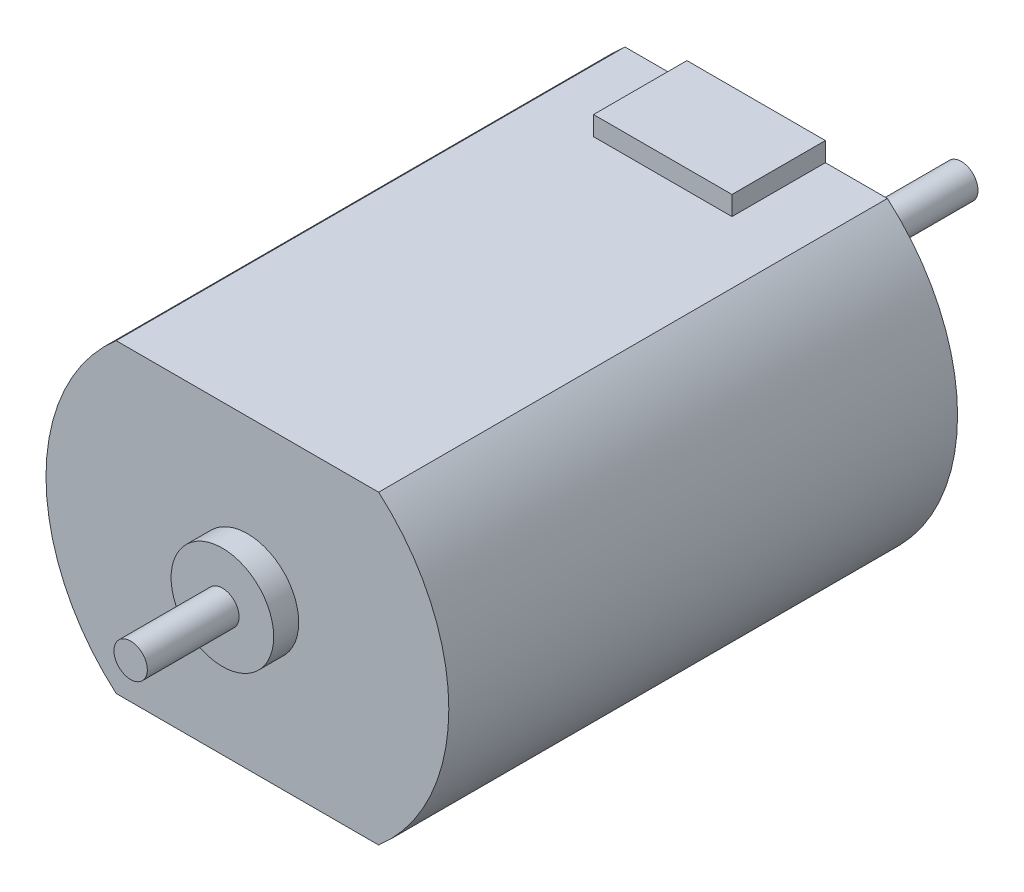
ISO-10303-21;
HEADER;
FILE_DESCRIPTION(('STEP AP214'),'2;1');
FILE_NAME('part.step','',(''),(''),'','','');
FILE_SCHEMA(('AUTOMOTIVE_DESIGN { 1 0 10303 214 1 1 1 1 }'));
ENDSEC;
DATA;
#1=APPLICATION_CONTEXT('core data for automotive mechanical design processes');
#2=APPLICATION_PROTOCOL_DEFINITION('international standard','automotive_design',2000,#1);
#3=PRODUCT_CONTEXT('',#1,'mechanical');
#4=PRODUCT('Part','Part','',(#3));
#5=PRODUCT_RELATED_PRODUCT_CATEGORY('part','',(#4));
#6=PRODUCT_DEFINITION_FORMATION('','',#4);
#7=PRODUCT_DEFINITION_CONTEXT('part definition',#1,'design');
#8=PRODUCT_DEFINITION('design','',#6,#7);
#9=PRODUCT_DEFINITION_SHAPE('','',#8);
#10=(LENGTH_UNIT() NAMED_UNIT(*) SI_UNIT(.MILLI.,.METRE.));
#11=(NAMED_UNIT(*) PLANE_ANGLE_UNIT() SI_UNIT($,.RADIAN.));
#12=(NAMED_UNIT(*) SI_UNIT($,.STERADIAN.) SOLID_ANGLE_UNIT());
#13=UNCERTAINTY_MEASURE_WITH_UNIT(LENGTH_MEASURE(1.E-05),#10,'distance_accuracy_value','');
#14=(GEOMETRIC_REPRESENTATION_CONTEXT(3) GLOBAL_UNCERTAINTY_ASSIGNED_CONTEXT((#13)) GLOBAL_UNIT_ASSIGNED_CONTEXT((#10,
#11,#12)) REPRESENTATION_CONTEXT('',''));
#15=CARTESIAN_POINT('',(0.,0.,0.));
#16=DIRECTION('',(0.,0.,1.));
#17=DIRECTION('',(1.,0.,0.));
#18=AXIS2_PLACEMENT_3D('',#15,#16,#17);
#19=CARTESIAN_POINT('',(-7.86765689389161,9.16,30.5));
#20=DIRECTION('',(0.,-1.,0.));
#21=DIRECTION('',(0.,0.,-1.));
#22=AXIS2_PLACEMENT_3D('',#19,#20,#21);
#23=PLANE('',#22);
#24=DIRECTION('',(0.,0.,1.));
#25=VECTOR('',#24,1.);
#26=CARTESIAN_POINT('',(-4.15,9.16,0.));
#27=LINE('',#26,#25);
#28=CARTESIAN_POINT('',(-4.15,9.16,0.));
#29=VERTEX_POINT('',#28);
#30=CARTESIAN_POINT('',(-4.15,9.16,5.6));
#31=VERTEX_POINT('',#30);
#32=EDGE_CURVE('E61',#29,#31,#27,.T.);
#33=ORIENTED_EDGE('',*,*,#32,.F.);
#34=DIRECTION('',(-1.,0.,0.));
#35=VECTOR('',#34,1.);
#36=CARTESIAN_POINT('',(-7.86765689389161,9.16,0.));
#37=LINE('',#36,#35);
#38=CARTESIAN_POINT('',(-7.86765689389161,9.16,0.));
#39=VERTEX_POINT('',#38);
#40=EDGE_CURVE('E157',#29,#39,#37,.T.);
#41=ORIENTED_EDGE('',*,*,#40,.T.);
#42=DIRECTION('',(0.,0.,-1.));
#43=VECTOR('',#42,1.);
#44=CARTESIAN_POINT('',(-7.86765689389161,9.16,30.5));
#45=LINE('',#44,#43);
#46=CARTESIAN_POINT('',(-7.86765689389161,9.16,30.5));
#47=VERTEX_POINT('',#46);
#48=EDGE_CURVE('E167',#47,#39,#45,.T.);
#49=ORIENTED_EDGE('',*,*,#48,.F.);
#50=DIRECTION('',(-1.,0.,0.));
#51=VECTOR('',#50,1.);
#52=CARTESIAN_POINT('',(-7.86765689389161,9.16,30.5));
#53=LINE('',#52,#51);
#54=CARTESIAN_POINT('',(7.86765689389161,9.16,30.5));
#55=VERTEX_POINT('',#54);
#56=EDGE_CURVE('E147',#55,#47,#53,.T.);
#57=ORIENTED_EDGE('',*,*,#56,.F.);
#58=DIRECTION('',(0.,0.,-1.));
#59=VECTOR('',#58,1.);
#60=CARTESIAN_POINT('',(7.86765689389161,9.16,30.5));
#61=LINE('',#60,#59);
#62=CARTESIAN_POINT('',(7.86765689389161,9.16,0.));
#63=VERTEX_POINT('',#62);
#64=EDGE_CURVE('E43',#55,#63,#61,.T.);
#65=ORIENTED_EDGE('',*,*,#64,.T.);
#66=CARTESIAN_POINT('',(4.15,9.16,0.));
#67=VERTEX_POINT('',#66);
#68=EDGE_CURVE('E158',#63,#67,#37,.T.);
#69=ORIENTED_EDGE('',*,*,#68,.T.);
#70=DIRECTION('',(0.,0.,-1.));
#71=VECTOR('',#70,1.);
#72=CARTESIAN_POINT('',(4.15,9.16,0.));
#73=LINE('',#72,#71);
#74=CARTESIAN_POINT('',(4.15,9.16,5.6));
#75=VERTEX_POINT('',#74);
#76=EDGE_CURVE('E123',#75,#67,#73,.T.);
#77=ORIENTED_EDGE('',*,*,#76,.F.);
#78=DIRECTION('',(1.,0.,0.));
#79=VECTOR('',#78,1.);
#80=CARTESIAN_POINT('',(-4.15,9.16,5.6));
#81=LINE('',#80,#79);
#82=EDGE_CURVE('E56',#31,#75,#81,.T.);
#83=ORIENTED_EDGE('',*,*,#82,.F.);
#84=EDGE_LOOP('',(#33,#41,#49,#57,#65,#69,#77,#83));
#85=FACE_BOUND('',#84,.T.);
#86=ADVANCED_FACE('F39',(#85),#23,.F.);
#87=CARTESIAN_POINT('',(0.,0.,30.5));
#88=DIRECTION('',(0.,0.,-1.));
#89=DIRECTION('',(-1.,0.,0.));
#90=AXIS2_PLACEMENT_3D('',#87,#88,#89);
#91=CYLINDRICAL_SURFACE('',#90,12.075);
#92=CARTESIAN_POINT('',(0.,0.,0.));
#93=DIRECTION('',(0.,0.,1.));
#94=DIRECTION('',(1.,0.,0.));
#95=AXIS2_PLACEMENT_3D('',#92,#93,#94);
#96=CIRCLE('',#95,12.075);
#97=CARTESIAN_POINT('',(7.86765689389161,-9.16,0.));
#98=VERTEX_POINT('',#97);
#99=EDGE_CURVE('E141',#98,#63,#96,.T.);
#100=ORIENTED_EDGE('',*,*,#99,.T.);
#101=ORIENTED_EDGE('',*,*,#64,.F.);
#102=CARTESIAN_POINT('',(0.,0.,30.5));
#103=DIRECTION('',(0.,0.,1.));
#104=DIRECTION('',(1.,0.,0.));
#105=AXIS2_PLACEMENT_3D('',#102,#103,#104);
#106=CIRCLE('',#105,12.075);
#107=CARTESIAN_POINT('',(7.86765689389161,-9.16,30.5));
#108=VERTEX_POINT('',#107);
#109=EDGE_CURVE('E144',#108,#55,#106,.T.);
#110=ORIENTED_EDGE('',*,*,#109,.F.);
#111=DIRECTION('',(0.,0.,-1.));
#112=VECTOR('',#111,1.);
#113=CARTESIAN_POINT('',(7.86765689389161,-9.16,30.5));
#114=LINE('',#113,#112);
#115=EDGE_CURVE('E154',#108,#98,#114,.T.);
#116=ORIENTED_EDGE('',*,*,#115,.T.);
#117=EDGE_LOOP('',(#100,#101,#110,#116));
#118=FACE_BOUND('',#117,.T.);
#119=ADVANCED_FACE('F41',(#118),#91,.T.);
#120=CARTESIAN_POINT('',(0.,0.,30.5));
#121=DIRECTION('',(0.,0.,-1.));
#122=DIRECTION('',(-1.,0.,0.));
#123=AXIS2_PLACEMENT_3D('',#120,#121,#122);
#124=CYLINDRICAL_SURFACE('',#123,12.075);
#125=CARTESIAN_POINT('',(0.,0.,0.));
#126=DIRECTION('',(0.,0.,1.));
#127=DIRECTION('',(1.,0.,0.));
#128=AXIS2_PLACEMENT_3D('',#125,#126,#127);
#129=CIRCLE('',#128,12.075);
#130=CARTESIAN_POINT('',(-7.86765689389161,-9.16,0.));
#131=VERTEX_POINT('',#130);
#132=EDGE_CURVE('E160',#39,#131,#129,.T.);
#133=ORIENTED_EDGE('',*,*,#132,.T.);
#134=DIRECTION('',(0.,0.,-1.));
#135=VECTOR('',#134,1.);
#136=CARTESIAN_POINT('',(-7.86765689389161,-9.16,30.5));
#137=LINE('',#136,#135);
#138=CARTESIAN_POINT('',(-7.86765689389161,-9.16,30.5));
#139=VERTEX_POINT('',#138);
#140=EDGE_CURVE('E165',#139,#131,#137,.T.);
#141=ORIENTED_EDGE('',*,*,#140,.F.);
#142=CARTESIAN_POINT('',(0.,0.,30.5));
#143=DIRECTION('',(0.,0.,1.));
#144=DIRECTION('',(1.,0.,0.));
#145=AXIS2_PLACEMENT_3D('',#142,#143,#144);
#146=CIRCLE('',#145,12.075);
#147=EDGE_CURVE('E150',#47,#139,#146,.T.);
#148=ORIENTED_EDGE('',*,*,#147,.F.);
#149=ORIENTED_EDGE('',*,*,#48,.T.);
#150=EDGE_LOOP('',(#133,#141,#148,#149));
#151=FACE_BOUND('',#150,.T.);
#152=ADVANCED_FACE('F231',(#151),#124,.T.);
#153=CARTESIAN_POINT('',(-7.86765689389161,-9.16,30.5));
#154=DIRECTION('',(0.,1.,0.));
#155=DIRECTION('',(0.,0.,1.));
#156=AXIS2_PLACEMENT_3D('',#153,#154,#155);
#157=PLANE('',#156);
#158=DIRECTION('',(1.,0.,0.));
#159=VECTOR('',#158,1.);
#160=CARTESIAN_POINT('',(-7.86765689389161,-9.16,0.));
#161=LINE('',#160,#159);
#162=EDGE_CURVE('E148',#131,#98,#161,.T.);
#163=ORIENTED_EDGE('',*,*,#162,.T.);
#164=ORIENTED_EDGE('',*,*,#115,.F.);
#165=DIRECTION('',(1.,0.,0.));
#166=VECTOR('',#165,1.);
#167=CARTESIAN_POINT('',(-7.86765689389161,-9.16,30.5));
#168=LINE('',#167,#166);
#169=EDGE_CURVE('E152',#139,#108,#168,.T.);
#170=ORIENTED_EDGE('',*,*,#169,.F.);
#171=ORIENTED_EDGE('',*,*,#140,.T.);
#172=EDGE_LOOP('',(#163,#164,#170,#171));
#173=FACE_BOUND('',#172,.T.);
#174=ADVANCED_FACE('F226',(#173),#157,.F.);
#175=CARTESIAN_POINT('',(0.,0.,30.5));
#176=DIRECTION('',(0.,0.,1.));
#177=DIRECTION('',(1.,0.,0.));
#178=AXIS2_PLACEMENT_3D('',#175,#176,#177);
#179=PLANE('',#178);
#180=CARTESIAN_POINT('',(0.,0.,30.5));
#181=DIRECTION('',(0.,0.,1.));
#182=DIRECTION('',(1.,0.,0.));
#183=AXIS2_PLACEMENT_3D('',#180,#181,#182);
#184=CIRCLE('',#183,3.075);
#185=CARTESIAN_POINT('',(3.075,0.,30.5));
#186=VERTEX_POINT('',#185);
#187=EDGE_CURVE('E48',#186,#186,#184,.T.);
#188=ORIENTED_EDGE('',*,*,#187,.F.);
#189=EDGE_LOOP('',(#188));
#190=FACE_BOUND('',#189,.T.);
#191=ORIENTED_EDGE('',*,*,#109,.T.);
#192=ORIENTED_EDGE('',*,*,#56,.T.);
#193=ORIENTED_EDGE('',*,*,#147,.T.);
#194=ORIENTED_EDGE('',*,*,#169,.T.);
#195=EDGE_LOOP('',(#191,#192,#193,#194));
#196=FACE_BOUND('',#195,.T.);
#197=ADVANCED_FACE('F223',(#190,#196),#179,.T.);
#198=CARTESIAN_POINT('',(0.,0.,0.));
#199=DIRECTION('',(0.,0.,1.));
#200=DIRECTION('',(1.,0.,0.));
#201=AXIS2_PLACEMENT_3D('',#198,#199,#200);
#202=PLANE('',#201);
#203=CARTESIAN_POINT('',(0.,0.,0.));
#204=DIRECTION('',(0.,0.,-1.));
#205=DIRECTION('',(-1.,0.,0.));
#206=AXIS2_PLACEMENT_3D('',#203,#204,#205);
#207=CIRCLE('',#206,4.23);
#208=CARTESIAN_POINT('',(-4.23,0.,0.));
#209=VERTEX_POINT('',#208);
#210=EDGE_CURVE('E138',#209,#209,#207,.T.);
#211=ORIENTED_EDGE('',*,*,#210,.F.);
#212=EDGE_LOOP('',(#211));
#213=FACE_BOUND('',#212,.T.);
#214=ORIENTED_EDGE('',*,*,#99,.F.);
#215=ORIENTED_EDGE('',*,*,#162,.F.);
#216=ORIENTED_EDGE('',*,*,#132,.F.);
#217=ORIENTED_EDGE('',*,*,#40,.F.);
#218=DIRECTION('',(0.,-1.,0.));
#219=VECTOR('',#218,1.);
#220=CARTESIAN_POINT('',(-4.15,10.31,0.));
#221=LINE('',#220,#219);
#222=CARTESIAN_POINT('',(-4.15,10.31,0.));
#223=VERTEX_POINT('',#222);
#224=EDGE_CURVE('E186',#223,#29,#221,.T.);
#225=ORIENTED_EDGE('',*,*,#224,.F.);
#226=DIRECTION('',(-1.,0.,0.));
#227=VECTOR('',#226,1.);
#228=CARTESIAN_POINT('',(-4.15,10.31,0.));
#229=LINE('',#228,#227);
#230=CARTESIAN_POINT('',(4.15,10.31,0.));
#231=VERTEX_POINT('',#230);
#232=EDGE_CURVE('E119',#231,#223,#229,.T.);
#233=ORIENTED_EDGE('',*,*,#232,.F.);
#234=DIRECTION('',(0.,-1.,0.));
#235=VECTOR('',#234,1.);
#236=CARTESIAN_POINT('',(4.15,10.31,0.));
#237=LINE('',#236,#235);
#238=EDGE_CURVE('E131',#231,#67,#237,.T.);
#239=ORIENTED_EDGE('',*,*,#238,.T.);
#240=ORIENTED_EDGE('',*,*,#68,.F.);
#241=EDGE_LOOP('',(#214,#215,#216,#217,#225,#233,#239,#240));
#242=FACE_BOUND('',#241,.T.);
#243=ADVANCED_FACE('F182',(#213,#242),#202,.F.);
#244=CARTESIAN_POINT('',(0.,0.,-2.));
#245=DIRECTION('',(0.,0.,1.));
#246=DIRECTION('',(1.,0.,0.));
#247=AXIS2_PLACEMENT_3D('',#244,#245,#246);
#248=CYLINDRICAL_SURFACE('',#247,4.23);
#249=CARTESIAN_POINT('',(0.,0.,-2.));
#250=DIRECTION('',(0.,0.,-1.));
#251=DIRECTION('',(-1.,0.,0.));
#252=AXIS2_PLACEMENT_3D('',#249,#250,#251);
#253=CIRCLE('',#252,4.23);
#254=CARTESIAN_POINT('',(-4.23,0.,-2.));
#255=VERTEX_POINT('',#254);
#256=EDGE_CURVE('E129',#255,#255,#253,.T.);
#257=ORIENTED_EDGE('',*,*,#256,.F.);
#258=EDGE_LOOP('',(#257));
#259=FACE_BOUND('',#258,.T.);
#260=ORIENTED_EDGE('',*,*,#210,.T.);
#261=EDGE_LOOP('',(#260));
#262=FACE_BOUND('',#261,.T.);
#263=ADVANCED_FACE('F255',(#259,#262),#248,.T.);
#264=CARTESIAN_POINT('',(0.,0.,-2.));
#265=DIRECTION('',(0.,0.,-1.));
#266=DIRECTION('',(-1.,0.,0.));
#267=AXIS2_PLACEMENT_3D('',#264,#265,#266);
#268=PLANE('',#267);
#269=CARTESIAN_POINT('',(0.,0.,-2.));
#270=DIRECTION('',(0.,0.,-1.));
#271=DIRECTION('',(-1.,0.,0.));
#272=AXIS2_PLACEMENT_3D('',#269,#270,#271);
#273=CIRCLE('',#272,1.);
#274=CARTESIAN_POINT('',(1.,0.,-2.));
#275=VERTEX_POINT('',#274);
#276=EDGE_CURVE('E135',#275,#275,#273,.T.);
#277=ORIENTED_EDGE('',*,*,#276,.F.);
#278=EDGE_LOOP('',(#277));
#279=FACE_BOUND('',#278,.T.);
#280=ORIENTED_EDGE('',*,*,#256,.T.);
#281=EDGE_LOOP('',(#280));
#282=FACE_BOUND('',#281,.T.);
#283=ADVANCED_FACE('F329',(#279,#282),#268,.T.);
#284=CARTESIAN_POINT('',(0.,0.,-12.3));
#285=DIRECTION('',(0.,0.,1.));
#286=DIRECTION('',(1.,0.,0.));
#287=AXIS2_PLACEMENT_3D('',#284,#285,#286);
#288=CYLINDRICAL_SURFACE('',#287,1.);
#289=CARTESIAN_POINT('',(0.,0.,-12.3));
#290=DIRECTION('',(0.,0.,-1.));
#291=DIRECTION('',(-1.,0.,0.));
#292=AXIS2_PLACEMENT_3D('',#289,#290,#291);
#293=CIRCLE('',#292,1.);
#294=CARTESIAN_POINT('',(1.,0.,-12.3));
#295=VERTEX_POINT('',#294);
#296=EDGE_CURVE('E126',#295,#295,#293,.T.);
#297=CARTESIAN_POINT('',(1.,0.,-12.3));
#298=CARTESIAN_POINT('',(1.,0.,-12.1927083333333));
#299=CARTESIAN_POINT('',(1.,0.,-12.0854166666667));
#300=CARTESIAN_POINT('',(1.,0.,-11.8708333333333));
#301=CARTESIAN_POINT('',(1.,0.,-11.7635416666667));
#302=CARTESIAN_POINT('',(1.,0.,-11.5489583333333));
#303=CARTESIAN_POINT('',(1.,0.,-11.4416666666667));
#304=CARTESIAN_POINT('',(1.,0.,-11.2270833333333));
#305=CARTESIAN_POINT('',(1.,0.,-11.1197916666667));
#306=CARTESIAN_POINT('',(1.,0.,-10.9052083333333));
#307=CARTESIAN_POINT('',(1.,0.,-10.7979166666667));
#308=CARTESIAN_POINT('',(1.,0.,-10.5833333333333));
#309=CARTESIAN_POINT('',(1.,0.,-10.4760416666667));
#310=CARTESIAN_POINT('',(1.,0.,-10.2614583333333));
#311=CARTESIAN_POINT('',(1.,0.,-10.1541666666667));
#312=CARTESIAN_POINT('',(1.,0.,-9.93958333333333));
#313=CARTESIAN_POINT('',(1.,0.,-9.83229166666667));
#314=CARTESIAN_POINT('',(1.,0.,-9.61770833333333));
#315=CARTESIAN_POINT('',(1.,0.,-9.51041666666667));
#316=CARTESIAN_POINT('',(1.,0.,-9.29583333333333));
#317=CARTESIAN_POINT('',(1.,0.,-9.18854166666667));
#318=CARTESIAN_POINT('',(1.,0.,-8.97395833333333));
#319=CARTESIAN_POINT('',(1.,0.,-8.86666666666667));
#320=CARTESIAN_POINT('',(1.,0.,-8.65208333333333));
#321=CARTESIAN_POINT('',(1.,0.,-8.54479166666667));
#322=CARTESIAN_POINT('',(1.,0.,-8.33020833333333));
#323=CARTESIAN_POINT('',(1.,0.,-8.22291666666667));
#324=CARTESIAN_POINT('',(1.,0.,-8.00833333333333));
#325=CARTESIAN_POINT('',(1.,0.,-7.90104166666667));
#326=CARTESIAN_POINT('',(1.,0.,-7.68645833333333));
#327=CARTESIAN_POINT('',(1.,0.,-7.57916666666667));
#328=CARTESIAN_POINT('',(1.,0.,-7.36458333333333));
#329=CARTESIAN_POINT('',(1.,0.,-7.25729166666667));
#330=CARTESIAN_POINT('',(1.,0.,-7.04270833333333));
#331=CARTESIAN_POINT('',(1.,0.,-6.93541666666667));
#332=CARTESIAN_POINT('',(1.,0.,-6.72083333333333));
#333=CARTESIAN_POINT('',(1.,0.,-6.61354166666667));
#334=CARTESIAN_POINT('',(1.,0.,-6.39895833333333));
#335=CARTESIAN_POINT('',(1.,0.,-6.29166666666667));
#336=CARTESIAN_POINT('',(1.,0.,-6.07708333333333));
#337=CARTESIAN_POINT('',(1.,0.,-5.96979166666667));
#338=CARTESIAN_POINT('',(1.,0.,-5.75520833333333));
#339=CARTESIAN_POINT('',(1.,0.,-5.64791666666667));
#340=CARTESIAN_POINT('',(1.,0.,-5.43333333333333));
#341=CARTESIAN_POINT('',(1.,0.,-5.32604166666667));
#342=CARTESIAN_POINT('',(1.,0.,-5.11145833333333));
#343=CARTESIAN_POINT('',(1.,0.,-5.00416666666667));
#344=CARTESIAN_POINT('',(1.,0.,-4.78958333333333));
#345=CARTESIAN_POINT('',(1.,0.,-4.68229166666667));
#346=CARTESIAN_POINT('',(1.,0.,-4.46770833333333));
#347=CARTESIAN_POINT('',(1.,0.,-4.36041666666666));
#348=CARTESIAN_POINT('',(1.,0.,-4.14583333333333));
#349=CARTESIAN_POINT('',(1.,0.,-4.03854166666667));
#350=CARTESIAN_POINT('',(1.,0.,-3.82395833333333));
#351=CARTESIAN_POINT('',(1.,0.,-3.71666666666667));
#352=CARTESIAN_POINT('',(1.,0.,-3.50208333333333));
#353=CARTESIAN_POINT('',(1.,0.,-3.39479166666667));
#354=CARTESIAN_POINT('',(1.,0.,-3.18020833333333));
#355=CARTESIAN_POINT('',(1.,0.,-3.07291666666666));
#356=CARTESIAN_POINT('',(1.,0.,-2.85833333333333));
#357=CARTESIAN_POINT('',(1.,0.,-2.75104166666667));
#358=CARTESIAN_POINT('',(1.,0.,-2.53645833333333));
#359=CARTESIAN_POINT('',(1.,0.,-2.42916666666666));
#360=CARTESIAN_POINT('',(1.,0.,-2.21458333333333));
#361=CARTESIAN_POINT('',(1.,0.,-2.10729166666667));
#362=CARTESIAN_POINT('',(1.,0.,-2.));
#363=B_SPLINE_CURVE_WITH_KNOTS('',3,(#297,#298,#299,#300,#301,#302,#303,#304,#305,#306,#307,
#308,#309,#310,#311,#312,#313,#314,#315,#316,#317,#318,#319,#320,#321,#322,#323,#324,#325,#326,
#327,#328,#329,#330,#331,#332,#333,#334,#335,#336,#337,#338,#339,#340,#341,#342,#343,#344,#345,
#346,#347,#348,#349,#350,#351,#352,#353,#354,#355,#356,#357,#358,#359,#360,#361,#362),
.UNSPECIFIED.,.F.,.F.,(4,2,2,2,2,2,2,2,2,2,2,2,2,2,2,2,2,2,2,2,2,2,2,2,2,2,2,2,2,2,2,2,4),(0.,
0.321874999999999,0.643749999999998,0.965625,1.2875,1.609375,1.93125,2.253125,2.575,2.896875,
3.21875,3.540625,3.8625,4.184375,4.50625,4.828125,5.15,5.471875,5.79375,6.115625,6.4375,
6.759375,7.08125,7.403125,7.725,8.046875,8.36875,8.690625,9.0125,9.334375,9.65625,9.978125,
10.3),.UNSPECIFIED.);
#364=EDGE_CURVE('BSEAM326',#295,#275,#363,.T.);
#365=ORIENTED_EDGE('',*,*,#296,.F.);
#366=ORIENTED_EDGE('',*,*,#276,.T.);
#367=ORIENTED_EDGE('',*,*,#364,.T.);
#368=ORIENTED_EDGE('',*,*,#364,.F.);
#369=EDGE_LOOP('',(#365,#367,#366,#368));
#370=FACE_BOUND('',#369,.T.);
#371=ADVANCED_FACE('F326',(#370),#288,.T.);
#372=CARTESIAN_POINT('',(0.,0.,-12.3));
#373=DIRECTION('',(0.,0.,-1.));
#374=DIRECTION('',(-1.,0.,0.));
#375=AXIS2_PLACEMENT_3D('',#372,#373,#374);
#376=PLANE('',#375);
#377=ORIENTED_EDGE('',*,*,#296,.T.);
#378=EDGE_LOOP('',(#377));
#379=FACE_BOUND('',#378,.T.);
#380=ADVANCED_FACE('F248',(#379),#376,.T.);
#381=CARTESIAN_POINT('',(-4.15,10.31,0.));
#382=DIRECTION('',(1.,0.,0.));
#383=DIRECTION('',(0.,0.,-1.));
#384=AXIS2_PLACEMENT_3D('',#381,#382,#383);
#385=PLANE('',#384);
#386=ORIENTED_EDGE('',*,*,#32,.T.);
#387=DIRECTION('',(0.,-1.,0.));
#388=VECTOR('',#387,1.);
#389=CARTESIAN_POINT('',(-4.15,10.31,5.6));
#390=LINE('',#389,#388);
#391=CARTESIAN_POINT('',(-4.15,10.31,5.6));
#392=VERTEX_POINT('',#391);
#393=EDGE_CURVE('E108',#392,#31,#390,.T.);
#394=ORIENTED_EDGE('',*,*,#393,.F.);
#395=DIRECTION('',(0.,0.,1.));
#396=VECTOR('',#395,1.);
#397=CARTESIAN_POINT('',(-4.15,10.31,0.));
#398=LINE('',#397,#396);
#399=EDGE_CURVE('E114',#223,#392,#398,.T.);
#400=ORIENTED_EDGE('',*,*,#399,.F.);
#401=ORIENTED_EDGE('',*,*,#224,.T.);
#402=EDGE_LOOP('',(#386,#394,#400,#401));
#403=FACE_BOUND('',#402,.T.);
#404=ADVANCED_FACE('F125',(#403),#385,.F.);
#405=CARTESIAN_POINT('',(-4.15,10.31,5.6));
#406=DIRECTION('',(0.,0.,-1.));
#407=DIRECTION('',(-1.,0.,0.));
#408=AXIS2_PLACEMENT_3D('',#405,#406,#407);
#409=PLANE('',#408);
#410=ORIENTED_EDGE('',*,*,#82,.T.);
#411=DIRECTION('',(0.,-1.,0.));
#412=VECTOR('',#411,1.);
#413=CARTESIAN_POINT('',(4.15,10.31,5.6));
#414=LINE('',#413,#412);
#415=CARTESIAN_POINT('',(4.15,10.31,5.6));
#416=VERTEX_POINT('',#415);
#417=EDGE_CURVE('E110',#416,#75,#414,.T.);
#418=ORIENTED_EDGE('',*,*,#417,.F.);
#419=DIRECTION('',(1.,0.,0.));
#420=VECTOR('',#419,1.);
#421=CARTESIAN_POINT('',(-4.15,10.31,5.6));
#422=LINE('',#421,#420);
#423=EDGE_CURVE('E104',#392,#416,#422,.T.);
#424=ORIENTED_EDGE('',*,*,#423,.F.);
#425=ORIENTED_EDGE('',*,*,#393,.T.);
#426=EDGE_LOOP('',(#410,#418,#424,#425));
#427=FACE_BOUND('',#426,.T.);
#428=ADVANCED_FACE('F106',(#427),#409,.F.);
#429=CARTESIAN_POINT('',(4.15,10.31,0.));
#430=DIRECTION('',(-1.,0.,0.));
#431=DIRECTION('',(0.,0.,1.));
#432=AXIS2_PLACEMENT_3D('',#429,#430,#431);
#433=PLANE('',#432);
#434=ORIENTED_EDGE('',*,*,#76,.T.);
#435=ORIENTED_EDGE('',*,*,#238,.F.);
#436=DIRECTION('',(0.,0.,-1.));
#437=VECTOR('',#436,1.);
#438=CARTESIAN_POINT('',(4.15,10.31,0.));
#439=LINE('',#438,#437);
#440=EDGE_CURVE('E113',#416,#231,#439,.T.);
#441=ORIENTED_EDGE('',*,*,#440,.F.);
#442=ORIENTED_EDGE('',*,*,#417,.T.);
#443=EDGE_LOOP('',(#434,#435,#441,#442));
#444=FACE_BOUND('',#443,.T.);
#445=ADVANCED_FACE('F270',(#444),#433,.F.);
#446=CARTESIAN_POINT('',(0.,10.31,0.));
#447=DIRECTION('',(0.,1.,0.));
#448=DIRECTION('',(0.,0.,1.));
#449=AXIS2_PLACEMENT_3D('',#446,#447,#448);
#450=PLANE('',#449);
#451=ORIENTED_EDGE('',*,*,#399,.T.);
#452=ORIENTED_EDGE('',*,*,#423,.T.);
#453=ORIENTED_EDGE('',*,*,#440,.T.);
#454=ORIENTED_EDGE('',*,*,#232,.T.);
#455=EDGE_LOOP('',(#451,#452,#453,#454));
#456=FACE_BOUND('',#455,.T.);
#457=ADVANCED_FACE('F117',(#456),#450,.T.);
#458=CARTESIAN_POINT('',(0.,0.,32.));
#459=DIRECTION('',(0.,0.,-1.));
#460=DIRECTION('',(-1.,0.,0.));
#461=AXIS2_PLACEMENT_3D('',#458,#459,#460);
#462=CYLINDRICAL_SURFACE('',#461,3.075);
#463=CARTESIAN_POINT('',(0.,0.,32.));
#464=DIRECTION('',(0.,0.,1.));
#465=DIRECTION('',(1.,0.,0.));
#466=AXIS2_PLACEMENT_3D('',#463,#464,#465);
#467=CIRCLE('',#466,3.075);
#468=CARTESIAN_POINT('',(3.075,0.,32.));
#469=VERTEX_POINT('',#468);
#470=EDGE_CURVE('E192',#469,#469,#467,.T.);
#471=ORIENTED_EDGE('',*,*,#470,.F.);
#472=EDGE_LOOP('',(#471));
#473=FACE_BOUND('',#472,.T.);
#474=ORIENTED_EDGE('',*,*,#187,.T.);
#475=EDGE_LOOP('',(#474));
#476=FACE_BOUND('',#475,.T.);
#477=ADVANCED_FACE('F214',(#473,#476),#462,.T.);
#478=CARTESIAN_POINT('',(0.,0.,32.));
#479=DIRECTION('',(0.,0.,1.));
#480=DIRECTION('',(1.,0.,0.));
#481=AXIS2_PLACEMENT_3D('',#478,#479,#480);
#482=PLANE('',#481);
#483=CARTESIAN_POINT('',(0.,0.,32.));
#484=DIRECTION('',(0.,0.,1.));
#485=DIRECTION('',(1.,0.,0.));
#486=AXIS2_PLACEMENT_3D('',#483,#484,#485);
#487=CIRCLE('',#486,1.);
#488=CARTESIAN_POINT('',(1.,0.,32.));
#489=VERTEX_POINT('',#488);
#490=EDGE_CURVE('E11',#489,#489,#487,.T.);
#491=ORIENTED_EDGE('',*,*,#490,.F.);
#492=EDGE_LOOP('',(#491));
#493=FACE_BOUND('',#492,.T.);
#494=ORIENTED_EDGE('',*,*,#470,.T.);
#495=EDGE_LOOP('',(#494));
#496=FACE_BOUND('',#495,.T.);
#497=ADVANCED_FACE('F208',(#493,#496),#482,.T.);
#498=CARTESIAN_POINT('',(0.,0.,37.5));
#499=DIRECTION('',(0.,0.,-1.));
#500=DIRECTION('',(-1.,0.,0.));
#501=AXIS2_PLACEMENT_3D('',#498,#499,#500);
#502=CYLINDRICAL_SURFACE('',#501,1.);
#503=CARTESIAN_POINT('',(0.,0.,37.5));
#504=DIRECTION('',(0.,0.,1.));
#505=DIRECTION('',(1.,0.,0.));
#506=AXIS2_PLACEMENT_3D('',#503,#504,#505);
#507=CIRCLE('',#506,1.);
#508=CARTESIAN_POINT('',(1.,0.,37.5));
#509=VERTEX_POINT('',#508);
#510=EDGE_CURVE('E198',#509,#509,#507,.T.);
#511=ORIENTED_EDGE('',*,*,#510,.F.);
#512=EDGE_LOOP('',(#511));
#513=FACE_BOUND('',#512,.T.);
#514=ORIENTED_EDGE('',*,*,#490,.T.);
#515=EDGE_LOOP('',(#514));
#516=FACE_BOUND('',#515,.T.);
#517=ADVANCED_FACE('F205',(#513,#516),#502,.T.);
#518=CARTESIAN_POINT('',(0.,0.,37.5));
#519=DIRECTION('',(0.,0.,1.));
#520=DIRECTION('',(1.,0.,0.));
#521=AXIS2_PLACEMENT_3D('',#518,#519,#520);
#522=PLANE('',#521);
#523=ORIENTED_EDGE('',*,*,#510,.T.);
#524=EDGE_LOOP('',(#523));
#525=FACE_BOUND('',#524,.T.);
#526=ADVANCED_FACE('F203',(#525),#522,.T.);
#527=CLOSED_SHELL('',(#86,#119,#152,#174,#197,#243,#263,#283,#371,#380,#404,#428,#445,#457,#477,
#497,#517,#526));
#528=MANIFOLD_SOLID_BREP('B2',#527);
#529=ADVANCED_BREP_SHAPE_REPRESENTATION('',(#18,#528),#14);
#530=SHAPE_DEFINITION_REPRESENTATION(#9,#529);
ENDSEC;
END-ISO-10303-21;
